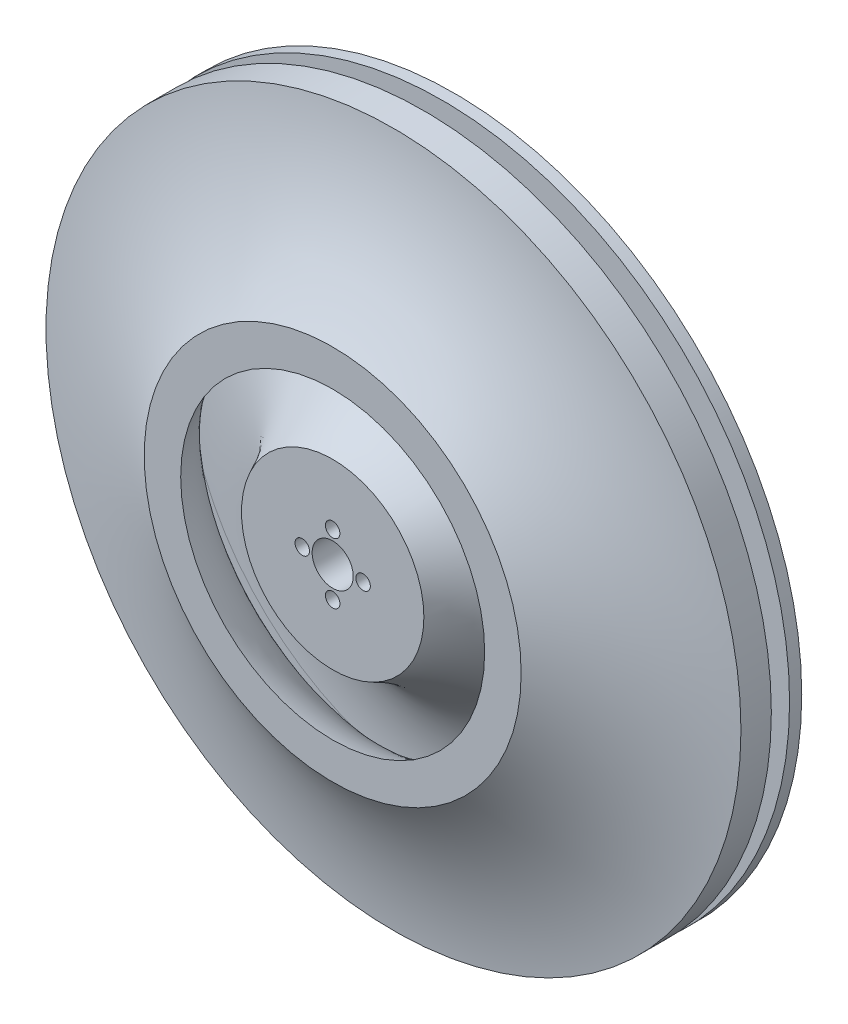
ISO-10303-21;
HEADER;
FILE_DESCRIPTION(('STEP AP214'),'2;1');
FILE_NAME('part.step','',(''),(''),'','','');
FILE_SCHEMA(('AUTOMOTIVE_DESIGN { 1 0 10303 214 1 1 1 1 }'));
ENDSEC;
DATA;
#1=APPLICATION_CONTEXT('core data for automotive mechanical design processes');
#2=APPLICATION_PROTOCOL_DEFINITION('international standard','automotive_design',2000,#1);
#3=PRODUCT_CONTEXT('',#1,'mechanical');
#4=PRODUCT('Part','Part','',(#3));
#5=PRODUCT_RELATED_PRODUCT_CATEGORY('part','',(#4));
#6=PRODUCT_DEFINITION_FORMATION('','',#4);
#7=PRODUCT_DEFINITION_CONTEXT('part definition',#1,'design');
#8=PRODUCT_DEFINITION('design','',#6,#7);
#9=PRODUCT_DEFINITION_SHAPE('','',#8);
#10=(LENGTH_UNIT() NAMED_UNIT(*) SI_UNIT(.MILLI.,.METRE.));
#11=(NAMED_UNIT(*) PLANE_ANGLE_UNIT() SI_UNIT($,.RADIAN.));
#12=(NAMED_UNIT(*) SI_UNIT($,.STERADIAN.) SOLID_ANGLE_UNIT());
#13=UNCERTAINTY_MEASURE_WITH_UNIT(LENGTH_MEASURE(1.E-05),#10,'distance_accuracy_value','');
#14=(GEOMETRIC_REPRESENTATION_CONTEXT(3) GLOBAL_UNCERTAINTY_ASSIGNED_CONTEXT((#13)) GLOBAL_UNIT_ASSIGNED_CONTEXT((#10,
#11,#12)) REPRESENTATION_CONTEXT('',''));
#15=CARTESIAN_POINT('',(0.,0.,0.));
#16=DIRECTION('',(0.,0.,1.));
#17=DIRECTION('',(1.,0.,0.));
#18=AXIS2_PLACEMENT_3D('',#15,#16,#17);
#19=CARTESIAN_POINT('',(0.,-57.15,2.));
#20=DIRECTION('',(0.,0.,-1.));
#21=DIRECTION('',(-1.,0.,0.));
#22=AXIS2_PLACEMENT_3D('',#19,#20,#21);
#23=PLANE('',#22);
#24=CARTESIAN_POINT('',(0.,0.,1.99999999999999));
#25=DIRECTION('',(0.,0.,1.));
#26=DIRECTION('',(1.,0.,0.));
#27=AXIS2_PLACEMENT_3D('',#24,#25,#26);
#28=CIRCLE('',#27,42.15);
#29=CARTESIAN_POINT('',(42.15,0.,1.99999999999999));
#30=VERTEX_POINT('',#29);
#31=EDGE_CURVE('E11',#30,#30,#28,.T.);
#32=ORIENTED_EDGE('',*,*,#31,.F.);
#33=EDGE_LOOP('',(#32));
#34=FACE_BOUND('',#33,.T.);
#35=CARTESIAN_POINT('',(0.,0.,1.99999999999999));
#36=DIRECTION('',(0.,0.,1.));
#37=DIRECTION('',(1.,0.,0.));
#38=AXIS2_PLACEMENT_3D('',#35,#36,#37);
#39=CIRCLE('',#38,57.15);
#40=CARTESIAN_POINT('',(57.15,0.,1.99999999999999));
#41=VERTEX_POINT('',#40);
#42=EDGE_CURVE('E122',#41,#41,#39,.T.);
#43=ORIENTED_EDGE('',*,*,#42,.T.);
#44=EDGE_LOOP('',(#43));
#45=FACE_BOUND('',#44,.T.);
#46=ADVANCED_FACE('F52',(#34,#45),#23,.F.);
#47=CARTESIAN_POINT('',(0.,0.,21.));
#48=DIRECTION('',(0.,0.,1.));
#49=DIRECTION('',(1.,0.,0.));
#50=AXIS2_PLACEMENT_3D('',#47,#48,#49);
#51=CYLINDRICAL_SURFACE('',#50,57.15);
#52=ORIENTED_EDGE('',*,*,#42,.F.);
#53=EDGE_LOOP('',(#52));
#54=FACE_BOUND('',#53,.T.);
#55=CARTESIAN_POINT('',(0.,0.,0.));
#56=DIRECTION('',(0.,0.,1.));
#57=DIRECTION('',(1.,0.,0.));
#58=AXIS2_PLACEMENT_3D('',#55,#56,#57);
#59=CIRCLE('',#58,57.15);
#60=CARTESIAN_POINT('',(57.15,0.,0.));
#61=VERTEX_POINT('',#60);
#62=EDGE_CURVE('E121',#61,#61,#59,.T.);
#63=ORIENTED_EDGE('',*,*,#62,.T.);
#64=EDGE_LOOP('',(#63));
#65=FACE_BOUND('',#64,.T.);
#66=ADVANCED_FACE('F174',(#54,#65),#51,.T.);
#67=CARTESIAN_POINT('',(0.,-37.025,0.));
#68=DIRECTION('',(0.,0.,1.));
#69=DIRECTION('',(1.,0.,0.));
#70=AXIS2_PLACEMENT_3D('',#67,#68,#69);
#71=PLANE('',#70);
#72=ORIENTED_EDGE('',*,*,#62,.F.);
#73=EDGE_LOOP('',(#72));
#74=FACE_BOUND('',#73,.T.);
#75=CARTESIAN_POINT('',(0.,0.,0.));
#76=DIRECTION('',(0.,0.,1.));
#77=DIRECTION('',(1.,0.,0.));
#78=AXIS2_PLACEMENT_3D('',#75,#76,#77);
#79=CIRCLE('',#78,37.025);
#80=CARTESIAN_POINT('',(37.025,0.,0.));
#81=VERTEX_POINT('',#80);
#82=EDGE_CURVE('E116',#81,#81,#79,.T.);
#83=ORIENTED_EDGE('',*,*,#82,.T.);
#84=EDGE_LOOP('',(#83));
#85=FACE_BOUND('',#84,.T.);
#86=ADVANCED_FACE('F179',(#74,#85),#71,.F.);
#87=CARTESIAN_POINT('',(0.,0.,21.));
#88=DIRECTION('',(0.,0.,1.));
#89=DIRECTION('',(1.,0.,0.));
#90=AXIS2_PLACEMENT_3D('',#87,#88,#89);
#91=CYLINDRICAL_SURFACE('',#90,37.025);
#92=ORIENTED_EDGE('',*,*,#82,.F.);
#93=EDGE_LOOP('',(#92));
#94=FACE_BOUND('',#93,.T.);
#95=CARTESIAN_POINT('',(0.,0.,1.));
#96=DIRECTION('',(0.,0.,1.));
#97=DIRECTION('',(1.,0.,0.));
#98=AXIS2_PLACEMENT_3D('',#95,#96,#97);
#99=CIRCLE('',#98,37.025);
#100=CARTESIAN_POINT('',(37.025,0.,1.));
#101=VERTEX_POINT('',#100);
#102=EDGE_CURVE('E113',#101,#101,#99,.T.);
#103=ORIENTED_EDGE('',*,*,#102,.T.);
#104=EDGE_LOOP('',(#103));
#105=FACE_BOUND('',#104,.T.);
#106=ADVANCED_FACE('F187',(#94,#105),#91,.F.);
#107=CARTESIAN_POINT('',(0.,-34.775,1.));
#108=DIRECTION('',(0.,0.,1.));
#109=DIRECTION('',(1.,0.,0.));
#110=AXIS2_PLACEMENT_3D('',#107,#108,#109);
#111=PLANE('',#110);
#112=ORIENTED_EDGE('',*,*,#102,.F.);
#113=EDGE_LOOP('',(#112));
#114=FACE_BOUND('',#113,.T.);
#115=CARTESIAN_POINT('',(0.,0.,1.));
#116=DIRECTION('',(0.,0.,1.));
#117=DIRECTION('',(1.,0.,0.));
#118=AXIS2_PLACEMENT_3D('',#115,#116,#117);
#119=CIRCLE('',#118,34.775);
#120=CARTESIAN_POINT('',(34.775,0.,1.));
#121=VERTEX_POINT('',#120);
#122=EDGE_CURVE('E115',#121,#121,#119,.T.);
#123=ORIENTED_EDGE('',*,*,#122,.T.);
#124=EDGE_LOOP('',(#123));
#125=FACE_BOUND('',#124,.T.);
#126=ADVANCED_FACE('F192',(#114,#125),#111,.F.);
#127=CARTESIAN_POINT('',(0.,0.,21.));
#128=DIRECTION('',(0.,0.,1.));
#129=DIRECTION('',(1.,0.,0.));
#130=AXIS2_PLACEMENT_3D('',#127,#128,#129);
#131=CYLINDRICAL_SURFACE('',#130,34.775);
#132=ORIENTED_EDGE('',*,*,#122,.F.);
#133=EDGE_LOOP('',(#132));
#134=FACE_BOUND('',#133,.T.);
#135=CARTESIAN_POINT('',(0.,0.,0.));
#136=DIRECTION('',(0.,0.,1.));
#137=DIRECTION('',(1.,0.,0.));
#138=AXIS2_PLACEMENT_3D('',#135,#136,#137);
#139=CIRCLE('',#138,34.775);
#140=CARTESIAN_POINT('',(34.775,0.,0.));
#141=VERTEX_POINT('',#140);
#142=EDGE_CURVE('E108',#141,#141,#139,.T.);
#143=ORIENTED_EDGE('',*,*,#142,.T.);
#144=EDGE_LOOP('',(#143));
#145=FACE_BOUND('',#144,.T.);
#146=ADVANCED_FACE('F196',(#134,#145),#131,.T.);
#147=CARTESIAN_POINT('',(0.,-33.025,0.));
#148=DIRECTION('',(0.,0.,1.));
#149=DIRECTION('',(1.,0.,0.));
#150=AXIS2_PLACEMENT_3D('',#147,#148,#149);
#151=PLANE('',#150);
#152=ORIENTED_EDGE('',*,*,#142,.F.);
#153=EDGE_LOOP('',(#152));
#154=FACE_BOUND('',#153,.T.);
#155=CARTESIAN_POINT('',(0.,0.,0.));
#156=DIRECTION('',(0.,0.,1.));
#157=DIRECTION('',(1.,0.,0.));
#158=AXIS2_PLACEMENT_3D('',#155,#156,#157);
#159=CIRCLE('',#158,33.025);
#160=CARTESIAN_POINT('',(33.025,0.,0.));
#161=VERTEX_POINT('',#160);
#162=EDGE_CURVE('E106',#161,#161,#159,.T.);
#163=ORIENTED_EDGE('',*,*,#162,.T.);
#164=EDGE_LOOP('',(#163));
#165=FACE_BOUND('',#164,.T.);
#166=ADVANCED_FACE('F205',(#154,#165),#151,.F.);
#167=CARTESIAN_POINT('',(0.,0.,21.));
#168=DIRECTION('',(0.,0.,1.));
#169=DIRECTION('',(1.,0.,0.));
#170=AXIS2_PLACEMENT_3D('',#167,#168,#169);
#171=CYLINDRICAL_SURFACE('',#170,33.025);
#172=ORIENTED_EDGE('',*,*,#162,.F.);
#173=EDGE_LOOP('',(#172));
#174=FACE_BOUND('',#173,.T.);
#175=CARTESIAN_POINT('',(0.,0.,1.));
#176=DIRECTION('',(0.,0.,1.));
#177=DIRECTION('',(1.,0.,0.));
#178=AXIS2_PLACEMENT_3D('',#175,#176,#177);
#179=CIRCLE('',#178,33.025);
#180=CARTESIAN_POINT('',(33.025,0.,1.));
#181=VERTEX_POINT('',#180);
#182=EDGE_CURVE('E103',#181,#181,#179,.T.);
#183=ORIENTED_EDGE('',*,*,#182,.T.);
#184=EDGE_LOOP('',(#183));
#185=FACE_BOUND('',#184,.T.);
#186=ADVANCED_FACE('F206',(#174,#185),#171,.F.);
#187=CARTESIAN_POINT('',(0.,-30.775,1.));
#188=DIRECTION('',(0.,0.,1.));
#189=DIRECTION('',(1.,0.,0.));
#190=AXIS2_PLACEMENT_3D('',#187,#188,#189);
#191=PLANE('',#190);
#192=ORIENTED_EDGE('',*,*,#182,.F.);
#193=EDGE_LOOP('',(#192));
#194=FACE_BOUND('',#193,.T.);
#195=CARTESIAN_POINT('',(0.,0.,1.));
#196=DIRECTION('',(0.,0.,1.));
#197=DIRECTION('',(1.,0.,0.));
#198=AXIS2_PLACEMENT_3D('',#195,#196,#197);
#199=CIRCLE('',#198,30.775);
#200=CARTESIAN_POINT('',(30.775,0.,1.));
#201=VERTEX_POINT('',#200);
#202=EDGE_CURVE('E99',#201,#201,#199,.T.);
#203=ORIENTED_EDGE('',*,*,#202,.T.);
#204=EDGE_LOOP('',(#203));
#205=FACE_BOUND('',#204,.T.);
#206=ADVANCED_FACE('F209',(#194,#205),#191,.F.);
#207=CARTESIAN_POINT('',(0.,0.,21.));
#208=DIRECTION('',(0.,0.,1.));
#209=DIRECTION('',(1.,0.,0.));
#210=AXIS2_PLACEMENT_3D('',#207,#208,#209);
#211=CYLINDRICAL_SURFACE('',#210,30.775);
#212=ORIENTED_EDGE('',*,*,#202,.F.);
#213=EDGE_LOOP('',(#212));
#214=FACE_BOUND('',#213,.T.);
#215=CARTESIAN_POINT('',(0.,0.,0.));
#216=DIRECTION('',(0.,0.,1.));
#217=DIRECTION('',(1.,0.,0.));
#218=AXIS2_PLACEMENT_3D('',#215,#216,#217);
#219=CIRCLE('',#218,30.775);
#220=CARTESIAN_POINT('',(30.775,0.,0.));
#221=VERTEX_POINT('',#220);
#222=EDGE_CURVE('E100',#221,#221,#219,.T.);
#223=ORIENTED_EDGE('',*,*,#222,.T.);
#224=EDGE_LOOP('',(#223));
#225=FACE_BOUND('',#224,.T.);
#226=ADVANCED_FACE('F212',(#214,#225),#211,.T.);
#227=CARTESIAN_POINT('',(0.,-29.025,0.));
#228=DIRECTION('',(0.,0.,1.));
#229=DIRECTION('',(1.,0.,0.));
#230=AXIS2_PLACEMENT_3D('',#227,#228,#229);
#231=PLANE('',#230);
#232=ORIENTED_EDGE('',*,*,#222,.F.);
#233=EDGE_LOOP('',(#232));
#234=FACE_BOUND('',#233,.T.);
#235=CARTESIAN_POINT('',(0.,0.,0.));
#236=DIRECTION('',(0.,0.,1.));
#237=DIRECTION('',(1.,0.,0.));
#238=AXIS2_PLACEMENT_3D('',#235,#236,#237);
#239=CIRCLE('',#238,29.025);
#240=CARTESIAN_POINT('',(29.025,0.,0.));
#241=VERTEX_POINT('',#240);
#242=EDGE_CURVE('E94',#241,#241,#239,.T.);
#243=ORIENTED_EDGE('',*,*,#242,.T.);
#244=EDGE_LOOP('',(#243));
#245=FACE_BOUND('',#244,.T.);
#246=ADVANCED_FACE('F217',(#234,#245),#231,.F.);
#247=CARTESIAN_POINT('',(0.,0.,21.));
#248=DIRECTION('',(0.,0.,1.));
#249=DIRECTION('',(1.,0.,0.));
#250=AXIS2_PLACEMENT_3D('',#247,#248,#249);
#251=CYLINDRICAL_SURFACE('',#250,29.025);
#252=ORIENTED_EDGE('',*,*,#242,.F.);
#253=EDGE_LOOP('',(#252));
#254=FACE_BOUND('',#253,.T.);
#255=CARTESIAN_POINT('',(0.,0.,1.));
#256=DIRECTION('',(0.,0.,1.));
#257=DIRECTION('',(1.,0.,0.));
#258=AXIS2_PLACEMENT_3D('',#255,#256,#257);
#259=CIRCLE('',#258,29.025);
#260=CARTESIAN_POINT('',(29.025,0.,1.));
#261=VERTEX_POINT('',#260);
#262=EDGE_CURVE('E93',#261,#261,#259,.T.);
#263=ORIENTED_EDGE('',*,*,#262,.T.);
#264=EDGE_LOOP('',(#263));
#265=FACE_BOUND('',#264,.T.);
#266=ADVANCED_FACE('F225',(#254,#265),#251,.F.);
#267=CARTESIAN_POINT('',(0.,-26.775,1.));
#268=DIRECTION('',(0.,0.,1.));
#269=DIRECTION('',(1.,0.,0.));
#270=AXIS2_PLACEMENT_3D('',#267,#268,#269);
#271=PLANE('',#270);
#272=ORIENTED_EDGE('',*,*,#262,.F.);
#273=EDGE_LOOP('',(#272));
#274=FACE_BOUND('',#273,.T.);
#275=CARTESIAN_POINT('',(0.,0.,1.));
#276=DIRECTION('',(0.,0.,1.));
#277=DIRECTION('',(1.,0.,0.));
#278=AXIS2_PLACEMENT_3D('',#275,#276,#277);
#279=CIRCLE('',#278,26.775);
#280=CARTESIAN_POINT('',(26.775,0.,1.));
#281=VERTEX_POINT('',#280);
#282=EDGE_CURVE('E86',#281,#281,#279,.T.);
#283=ORIENTED_EDGE('',*,*,#282,.T.);
#284=EDGE_LOOP('',(#283));
#285=FACE_BOUND('',#284,.T.);
#286=ADVANCED_FACE('F228',(#274,#285),#271,.F.);
#287=CARTESIAN_POINT('',(0.,0.,21.));
#288=DIRECTION('',(0.,0.,1.));
#289=DIRECTION('',(1.,0.,0.));
#290=AXIS2_PLACEMENT_3D('',#287,#288,#289);
#291=CYLINDRICAL_SURFACE('',#290,26.775);
#292=ORIENTED_EDGE('',*,*,#282,.F.);
#293=EDGE_LOOP('',(#292));
#294=FACE_BOUND('',#293,.T.);
#295=CARTESIAN_POINT('',(0.,0.,0.));
#296=DIRECTION('',(0.,0.,1.));
#297=DIRECTION('',(1.,0.,0.));
#298=AXIS2_PLACEMENT_3D('',#295,#296,#297);
#299=CIRCLE('',#298,26.775);
#300=CARTESIAN_POINT('',(26.775,0.,0.));
#301=VERTEX_POINT('',#300);
#302=EDGE_CURVE('E84',#301,#301,#299,.T.);
#303=ORIENTED_EDGE('',*,*,#302,.T.);
#304=EDGE_LOOP('',(#303));
#305=FACE_BOUND('',#304,.T.);
#306=ADVANCED_FACE('F227',(#294,#305),#291,.T.);
#307=CARTESIAN_POINT('',(0.,-25.025,0.));
#308=DIRECTION('',(0.,0.,1.));
#309=DIRECTION('',(1.,0.,0.));
#310=AXIS2_PLACEMENT_3D('',#307,#308,#309);
#311=PLANE('',#310);
#312=ORIENTED_EDGE('',*,*,#302,.F.);
#313=EDGE_LOOP('',(#312));
#314=FACE_BOUND('',#313,.T.);
#315=CARTESIAN_POINT('',(0.,0.,0.));
#316=DIRECTION('',(0.,0.,1.));
#317=DIRECTION('',(1.,0.,0.));
#318=AXIS2_PLACEMENT_3D('',#315,#316,#317);
#319=CIRCLE('',#318,25.025);
#320=CARTESIAN_POINT('',(25.025,0.,0.));
#321=VERTEX_POINT('',#320);
#322=EDGE_CURVE('E85',#321,#321,#319,.T.);
#323=ORIENTED_EDGE('',*,*,#322,.T.);
#324=EDGE_LOOP('',(#323));
#325=FACE_BOUND('',#324,.T.);
#326=ADVANCED_FACE('F232',(#314,#325),#311,.F.);
#327=CARTESIAN_POINT('',(0.,0.,21.));
#328=DIRECTION('',(0.,0.,1.));
#329=DIRECTION('',(1.,0.,0.));
#330=AXIS2_PLACEMENT_3D('',#327,#328,#329);
#331=CYLINDRICAL_SURFACE('',#330,25.025);
#332=ORIENTED_EDGE('',*,*,#322,.F.);
#333=EDGE_LOOP('',(#332));
#334=FACE_BOUND('',#333,.T.);
#335=CARTESIAN_POINT('',(0.,0.,1.));
#336=DIRECTION('',(0.,0.,1.));
#337=DIRECTION('',(1.,0.,0.));
#338=AXIS2_PLACEMENT_3D('',#335,#336,#337);
#339=CIRCLE('',#338,25.025);
#340=CARTESIAN_POINT('',(25.025,0.,1.));
#341=VERTEX_POINT('',#340);
#342=EDGE_CURVE('E79',#341,#341,#339,.T.);
#343=ORIENTED_EDGE('',*,*,#342,.T.);
#344=EDGE_LOOP('',(#343));
#345=FACE_BOUND('',#344,.T.);
#346=ADVANCED_FACE('F236',(#334,#345),#331,.F.);
#347=CARTESIAN_POINT('',(0.,-22.775,1.));
#348=DIRECTION('',(0.,0.,1.));
#349=DIRECTION('',(1.,0.,0.));
#350=AXIS2_PLACEMENT_3D('',#347,#348,#349);
#351=PLANE('',#350);
#352=ORIENTED_EDGE('',*,*,#342,.F.);
#353=EDGE_LOOP('',(#352));
#354=FACE_BOUND('',#353,.T.);
#355=CARTESIAN_POINT('',(0.,0.,1.));
#356=DIRECTION('',(0.,0.,1.));
#357=DIRECTION('',(1.,0.,0.));
#358=AXIS2_PLACEMENT_3D('',#355,#356,#357);
#359=CIRCLE('',#358,22.775);
#360=CARTESIAN_POINT('',(22.775,0.,1.));
#361=VERTEX_POINT('',#360);
#362=EDGE_CURVE('E78',#361,#361,#359,.T.);
#363=ORIENTED_EDGE('',*,*,#362,.T.);
#364=EDGE_LOOP('',(#363));
#365=FACE_BOUND('',#364,.T.);
#366=ADVANCED_FACE('F245',(#354,#365),#351,.F.);
#367=CARTESIAN_POINT('',(0.,0.,21.));
#368=DIRECTION('',(0.,0.,1.));
#369=DIRECTION('',(1.,0.,0.));
#370=AXIS2_PLACEMENT_3D('',#367,#368,#369);
#371=CYLINDRICAL_SURFACE('',#370,22.775);
#372=ORIENTED_EDGE('',*,*,#362,.F.);
#373=EDGE_LOOP('',(#372));
#374=FACE_BOUND('',#373,.T.);
#375=CARTESIAN_POINT('',(0.,0.,0.));
#376=DIRECTION('',(0.,0.,1.));
#377=DIRECTION('',(1.,0.,0.));
#378=AXIS2_PLACEMENT_3D('',#375,#376,#377);
#379=CIRCLE('',#378,22.775);
#380=CARTESIAN_POINT('',(22.775,0.,0.));
#381=VERTEX_POINT('',#380);
#382=EDGE_CURVE('E71',#381,#381,#379,.T.);
#383=ORIENTED_EDGE('',*,*,#382,.T.);
#384=EDGE_LOOP('',(#383));
#385=FACE_BOUND('',#384,.T.);
#386=ADVANCED_FACE('F246',(#374,#385),#371,.T.);
#387=CARTESIAN_POINT('',(0.,-22.775,0.));
#388=DIRECTION('',(0.,0.,-1.));
#389=DIRECTION('',(-1.,0.,0.));
#390=AXIS2_PLACEMENT_3D('',#387,#388,#389);
#391=PLANE('',#390);
#392=CARTESIAN_POINT('',(0.,0.,0.));
#393=DIRECTION('',(0.,0.,1.));
#394=DIRECTION('',(1.,0.,0.));
#395=AXIS2_PLACEMENT_3D('',#392,#393,#394);
#396=CIRCLE('',#395,12.5);
#397=CARTESIAN_POINT('',(12.5,0.,0.));
#398=VERTEX_POINT('',#397);
#399=EDGE_CURVE('E68',#398,#398,#396,.T.);
#400=ORIENTED_EDGE('',*,*,#399,.T.);
#401=EDGE_LOOP('',(#400));
#402=FACE_BOUND('',#401,.T.);
#403=ORIENTED_EDGE('',*,*,#382,.F.);
#404=EDGE_LOOP('',(#403));
#405=FACE_BOUND('',#404,.T.);
#406=ADVANCED_FACE('F249',(#402,#405),#391,.T.);
#407=CARTESIAN_POINT('',(0.,0.,21.));
#408=DIRECTION('',(0.,0.,1.));
#409=DIRECTION('',(1.,0.,0.));
#410=AXIS2_PLACEMENT_3D('',#407,#408,#409);
#411=CYLINDRICAL_SURFACE('',#410,12.5);
#412=ORIENTED_EDGE('',*,*,#399,.F.);
#413=EDGE_LOOP('',(#412));
#414=FACE_BOUND('',#413,.T.);
#415=CARTESIAN_POINT('',(0.,0.,-15.));
#416=DIRECTION('',(0.,0.,1.));
#417=DIRECTION('',(1.,0.,0.));
#418=AXIS2_PLACEMENT_3D('',#415,#416,#417);
#419=CIRCLE('',#418,12.5);
#420=CARTESIAN_POINT('',(12.5,0.,-15.));
#421=VERTEX_POINT('',#420);
#422=EDGE_CURVE('E64',#421,#421,#419,.T.);
#423=ORIENTED_EDGE('',*,*,#422,.T.);
#424=EDGE_LOOP('',(#423));
#425=FACE_BOUND('',#424,.T.);
#426=ADVANCED_FACE('F255',(#414,#425),#411,.T.);
#427=CARTESIAN_POINT('',(0.,0.,-15.));
#428=DIRECTION('',(0.,0.,1.));
#429=DIRECTION('',(1.,0.,0.));
#430=AXIS2_PLACEMENT_3D('',#427,#428,#429);
#431=PLANE('',#430);
#432=CARTESIAN_POINT('',(0.,-5.,-15.));
#433=DIRECTION('',(0.,0.,1.));
#434=DIRECTION('',(1.,0.,0.));
#435=AXIS2_PLACEMENT_3D('',#432,#433,#434);
#436=CIRCLE('',#435,1.190625);
#437=CARTESIAN_POINT('',(1.190625,-5.,-15.));
#438=VERTEX_POINT('',#437);
#439=EDGE_CURVE('E137',#438,#438,#436,.T.);
#440=ORIENTED_EDGE('',*,*,#439,.T.);
#441=EDGE_LOOP('',(#440));
#442=FACE_BOUND('',#441,.T.);
#443=CARTESIAN_POINT('',(0.,0.,-15.));
#444=DIRECTION('',(0.,0.,1.));
#445=DIRECTION('',(1.,0.,0.));
#446=AXIS2_PLACEMENT_3D('',#443,#444,#445);
#447=CIRCLE('',#446,3.3782);
#448=CARTESIAN_POINT('',(3.3782,0.,-15.));
#449=VERTEX_POINT('',#448);
#450=EDGE_CURVE('E148',#449,#449,#447,.T.);
#451=ORIENTED_EDGE('',*,*,#450,.T.);
#452=EDGE_LOOP('',(#451));
#453=FACE_BOUND('',#452,.T.);
#454=CARTESIAN_POINT('',(5.,0.,-15.));
#455=DIRECTION('',(0.,0.,1.));
#456=DIRECTION('',(1.,0.,0.));
#457=AXIS2_PLACEMENT_3D('',#454,#455,#456);
#458=CIRCLE('',#457,1.190625);
#459=CARTESIAN_POINT('',(6.190625,0.,-15.));
#460=VERTEX_POINT('',#459);
#461=EDGE_CURVE('E144',#460,#460,#458,.T.);
#462=ORIENTED_EDGE('',*,*,#461,.T.);
#463=EDGE_LOOP('',(#462));
#464=FACE_BOUND('',#463,.T.);
#465=CARTESIAN_POINT('',(0.,5.,-15.));
#466=DIRECTION('',(0.,0.,1.));
#467=DIRECTION('',(1.,0.,0.));
#468=AXIS2_PLACEMENT_3D('',#465,#466,#467);
#469=CIRCLE('',#468,1.190625);
#470=CARTESIAN_POINT('',(1.190625,5.,-15.));
#471=VERTEX_POINT('',#470);
#472=EDGE_CURVE('E135',#471,#471,#469,.T.);
#473=ORIENTED_EDGE('',*,*,#472,.T.);
#474=EDGE_LOOP('',(#473));
#475=FACE_BOUND('',#474,.T.);
#476=CARTESIAN_POINT('',(-5.,0.,-15.));
#477=DIRECTION('',(0.,0.,1.));
#478=DIRECTION('',(1.,0.,0.));
#479=AXIS2_PLACEMENT_3D('',#476,#477,#478);
#480=CIRCLE('',#479,1.190625);
#481=CARTESIAN_POINT('',(-3.809375,0.,-15.));
#482=VERTEX_POINT('',#481);
#483=EDGE_CURVE('E133',#482,#482,#480,.T.);
#484=ORIENTED_EDGE('',*,*,#483,.T.);
#485=EDGE_LOOP('',(#484));
#486=FACE_BOUND('',#485,.T.);
#487=ORIENTED_EDGE('',*,*,#422,.F.);
#488=EDGE_LOOP('',(#487));
#489=FACE_BOUND('',#488,.T.);
#490=ADVANCED_FACE('F158',(#442,#453,#464,#475,#486,#489),#431,.F.);
#491=CARTESIAN_POINT('',(0.,-15.,20.));
#492=DIRECTION('',(0.,0.,-1.));
#493=DIRECTION('',(-1.,0.,0.));
#494=AXIS2_PLACEMENT_3D('',#491,#492,#493);
#495=PLANE('',#494);
#496=CARTESIAN_POINT('',(0.,-5.,20.));
#497=DIRECTION('',(0.,0.,1.));
#498=DIRECTION('',(1.,0.,0.));
#499=AXIS2_PLACEMENT_3D('',#496,#497,#498);
#500=CIRCLE('',#499,1.190625);
#501=CARTESIAN_POINT('',(1.190625,-5.,20.));
#502=VERTEX_POINT('',#501);
#503=EDGE_CURVE('E130',#502,#502,#500,.T.);
#504=ORIENTED_EDGE('',*,*,#503,.F.);
#505=EDGE_LOOP('',(#504));
#506=FACE_BOUND('',#505,.T.);
#507=CARTESIAN_POINT('',(0.,0.,20.));
#508=DIRECTION('',(0.,0.,1.));
#509=DIRECTION('',(1.,0.,0.));
#510=AXIS2_PLACEMENT_3D('',#507,#508,#509);
#511=CIRCLE('',#510,3.3782);
#512=CARTESIAN_POINT('',(3.3782,0.,20.));
#513=VERTEX_POINT('',#512);
#514=EDGE_CURVE('E142',#513,#513,#511,.T.);
#515=ORIENTED_EDGE('',*,*,#514,.F.);
#516=EDGE_LOOP('',(#515));
#517=FACE_BOUND('',#516,.T.);
#518=CARTESIAN_POINT('',(5.,0.,20.));
#519=DIRECTION('',(0.,0.,1.));
#520=DIRECTION('',(1.,0.,0.));
#521=AXIS2_PLACEMENT_3D('',#518,#519,#520);
#522=CIRCLE('',#521,1.190625);
#523=CARTESIAN_POINT('',(6.190625,0.,20.));
#524=VERTEX_POINT('',#523);
#525=EDGE_CURVE('E132',#524,#524,#522,.T.);
#526=ORIENTED_EDGE('',*,*,#525,.F.);
#527=EDGE_LOOP('',(#526));
#528=FACE_BOUND('',#527,.T.);
#529=CARTESIAN_POINT('',(0.,5.,20.));
#530=DIRECTION('',(0.,0.,1.));
#531=DIRECTION('',(1.,0.,0.));
#532=AXIS2_PLACEMENT_3D('',#529,#530,#531);
#533=CIRCLE('',#532,1.190625);
#534=CARTESIAN_POINT('',(1.190625,5.,20.));
#535=VERTEX_POINT('',#534);
#536=EDGE_CURVE('E126',#535,#535,#533,.T.);
#537=ORIENTED_EDGE('',*,*,#536,.F.);
#538=EDGE_LOOP('',(#537));
#539=FACE_BOUND('',#538,.T.);
#540=CARTESIAN_POINT('',(-5.,0.,20.));
#541=DIRECTION('',(0.,0.,1.));
#542=DIRECTION('',(1.,0.,0.));
#543=AXIS2_PLACEMENT_3D('',#540,#541,#542);
#544=CIRCLE('',#543,1.190625);
#545=CARTESIAN_POINT('',(-3.809375,0.,20.));
#546=VERTEX_POINT('',#545);
#547=EDGE_CURVE('E136',#546,#546,#544,.T.);
#548=ORIENTED_EDGE('',*,*,#547,.F.);
#549=EDGE_LOOP('',(#548));
#550=FACE_BOUND('',#549,.T.);
#551=CARTESIAN_POINT('',(0.,0.,20.));
#552=DIRECTION('',(0.,0.,1.));
#553=DIRECTION('',(1.,0.,0.));
#554=AXIS2_PLACEMENT_3D('',#551,#552,#553);
#555=CIRCLE('',#554,15.);
#556=CARTESIAN_POINT('',(15.,0.,20.));
#557=VERTEX_POINT('',#556);
#558=EDGE_CURVE('E58',#557,#557,#555,.T.);
#559=ORIENTED_EDGE('',*,*,#558,.T.);
#560=EDGE_LOOP('',(#559));
#561=FACE_BOUND('',#560,.T.);
#562=ADVANCED_FACE('F257',(#506,#517,#528,#539,#550,#561),#495,.F.);
#563=CARTESIAN_POINT('',(0.,0.,31.475625));
#564=DIRECTION('',(0.,0.,1.));
#565=DIRECTION('',(1.,0.,0.));
#566=AXIS2_PLACEMENT_3D('',#563,#564,#565);
#567=TOROIDAL_SURFACE('',#566,42.15,29.475625);
#568=ORIENTED_EDGE('',*,*,#558,.F.);
#569=EDGE_LOOP('',(#568));
#570=FACE_BOUND('',#569,.T.);
#571=ORIENTED_EDGE('',*,*,#31,.T.);
#572=EDGE_LOOP('',(#571));
#573=FACE_BOUND('',#572,.T.);
#574=ADVANCED_FACE('F54',(#570,#573),#567,.F.);
#575=CARTESIAN_POINT('',(-5.,0.,20.));
#576=DIRECTION('',(0.,0.,-1.));
#577=DIRECTION('',(-1.,0.,0.));
#578=AXIS2_PLACEMENT_3D('',#575,#576,#577);
#579=CYLINDRICAL_SURFACE('',#578,1.190625);
#580=ORIENTED_EDGE('',*,*,#547,.T.);
#581=EDGE_LOOP('',(#580));
#582=FACE_BOUND('',#581,.T.);
#583=ORIENTED_EDGE('',*,*,#483,.F.);
#584=EDGE_LOOP('',(#583));
#585=FACE_BOUND('',#584,.T.);
#586=ADVANCED_FACE('F270',(#582,#585),#579,.F.);
#587=CARTESIAN_POINT('',(0.,5.,20.));
#588=DIRECTION('',(0.,0.,-1.));
#589=DIRECTION('',(-1.,0.,0.));
#590=AXIS2_PLACEMENT_3D('',#587,#588,#589);
#591=CYLINDRICAL_SURFACE('',#590,1.190625);
#592=ORIENTED_EDGE('',*,*,#536,.T.);
#593=EDGE_LOOP('',(#592));
#594=FACE_BOUND('',#593,.T.);
#595=ORIENTED_EDGE('',*,*,#472,.F.);
#596=EDGE_LOOP('',(#595));
#597=FACE_BOUND('',#596,.T.);
#598=ADVANCED_FACE('F183',(#594,#597),#591,.F.);
#599=CARTESIAN_POINT('',(5.,0.,20.));
#600=DIRECTION('',(0.,0.,-1.));
#601=DIRECTION('',(-1.,0.,0.));
#602=AXIS2_PLACEMENT_3D('',#599,#600,#601);
#603=CYLINDRICAL_SURFACE('',#602,1.190625);
#604=ORIENTED_EDGE('',*,*,#525,.T.);
#605=EDGE_LOOP('',(#604));
#606=FACE_BOUND('',#605,.T.);
#607=ORIENTED_EDGE('',*,*,#461,.F.);
#608=EDGE_LOOP('',(#607));
#609=FACE_BOUND('',#608,.T.);
#610=ADVANCED_FACE('F166',(#606,#609),#603,.F.);
#611=CARTESIAN_POINT('',(0.,0.,20.));
#612=DIRECTION('',(0.,0.,-1.));
#613=DIRECTION('',(-1.,0.,0.));
#614=AXIS2_PLACEMENT_3D('',#611,#612,#613);
#615=CYLINDRICAL_SURFACE('',#614,3.3782);
#616=ORIENTED_EDGE('',*,*,#514,.T.);
#617=EDGE_LOOP('',(#616));
#618=FACE_BOUND('',#617,.T.);
#619=ORIENTED_EDGE('',*,*,#450,.F.);
#620=EDGE_LOOP('',(#619));
#621=FACE_BOUND('',#620,.T.);
#622=ADVANCED_FACE('F162',(#618,#621),#615,.F.);
#623=CARTESIAN_POINT('',(0.,-5.,20.));
#624=DIRECTION('',(0.,0.,-1.));
#625=DIRECTION('',(-1.,0.,0.));
#626=AXIS2_PLACEMENT_3D('',#623,#624,#625);
#627=CYLINDRICAL_SURFACE('',#626,1.190625);
#628=ORIENTED_EDGE('',*,*,#503,.T.);
#629=EDGE_LOOP('',(#628));
#630=FACE_BOUND('',#629,.T.);
#631=ORIENTED_EDGE('',*,*,#439,.F.);
#632=EDGE_LOOP('',(#631));
#633=FACE_BOUND('',#632,.T.);
#634=ADVANCED_FACE('F161',(#630,#633),#627,.F.);
#635=CLOSED_SHELL('',(#46,#66,#86,#106,#126,#146,#166,#186,#206,#226,#246,#266,#286,#306,#326,
#346,#366,#386,#406,#426,#490,#562,#574,#586,#598,#610,#622,#634));
#636=MANIFOLD_SOLID_BREP('B2',#635);
#637=CARTESIAN_POINT('',(0.,0.,64.6801284490109));
#638=DIRECTION('',(0.,0.,1.));
#639=DIRECTION('',(1.,0.,0.));
#640=AXIS2_PLACEMENT_3D('',#637,#638,#639);
#641=TOROIDAL_SURFACE('',#640,63.0731370741916,55.);
#642=CARTESIAN_POINT('',(0.,0.,20.));
#643=DIRECTION('',(0.,0.,1.));
#644=DIRECTION('',(1.,0.,0.));
#645=AXIS2_PLACEMENT_3D('',#642,#643,#644);
#646=CIRCLE('',#645,31.);
#647=CARTESIAN_POINT('',(31.,0.,20.));
#648=VERTEX_POINT('',#647);
#649=EDGE_CURVE('E516',#648,#648,#646,.T.);
#650=ORIENTED_EDGE('',*,*,#649,.F.);
#651=EDGE_LOOP('',(#650));
#652=FACE_BOUND('',#651,.T.);
#653=CARTESIAN_POINT('',(0.,0.,10.));
#654=DIRECTION('',(0.,0.,1.));
#655=DIRECTION('',(1.,0.,0.));
#656=AXIS2_PLACEMENT_3D('',#653,#654,#655);
#657=CIRCLE('',#656,57.15);
#658=CARTESIAN_POINT('',(57.15,0.,10.));
#659=VERTEX_POINT('',#658);
#660=EDGE_CURVE('E55',#659,#659,#657,.T.);
#661=ORIENTED_EDGE('',*,*,#660,.T.);
#662=EDGE_LOOP('',(#661));
#663=FACE_BOUND('',#662,.T.);
#664=ADVANCED_FACE('F496',(#652,#663),#641,.F.);
#665=CARTESIAN_POINT('',(0.,0.,21.));
#666=DIRECTION('',(0.,0.,1.));
#667=DIRECTION('',(1.,0.,0.));
#668=AXIS2_PLACEMENT_3D('',#665,#666,#667);
#669=CYLINDRICAL_SURFACE('',#668,57.15);
#670=CARTESIAN_POINT('',(0.,0.,5.));
#671=DIRECTION('',(0.,0.,1.));
#672=DIRECTION('',(1.,0.,0.));
#673=AXIS2_PLACEMENT_3D('',#670,#671,#672);
#674=CIRCLE('',#673,57.15);
#675=CARTESIAN_POINT('',(57.15,0.,5.));
#676=VERTEX_POINT('',#675);
#677=EDGE_CURVE('E502',#676,#676,#674,.T.);
#678=ORIENTED_EDGE('',*,*,#677,.T.);
#679=EDGE_LOOP('',(#678));
#680=FACE_BOUND('',#679,.T.);
#681=ORIENTED_EDGE('',*,*,#660,.F.);
#682=EDGE_LOOP('',(#681));
#683=FACE_BOUND('',#682,.T.);
#684=ADVANCED_FACE('F524',(#680,#683),#669,.T.);
#685=CARTESIAN_POINT('',(0.,0.,5.));
#686=DIRECTION('',(0.,0.,-1.));
#687=DIRECTION('',(-1.,0.,0.));
#688=AXIS2_PLACEMENT_3D('',#685,#686,#687);
#689=CONICAL_SURFACE('',#688,57.15,1.48352986419518);
#690=CARTESIAN_POINT('',(0.,0.,6.31232995288886));
#691=DIRECTION('',(0.,0.,1.));
#692=DIRECTION('',(1.,0.,0.));
#693=AXIS2_PLACEMENT_3D('',#690,#691,#692);
#694=CIRCLE('',#693,42.15);
#695=CARTESIAN_POINT('',(42.15,0.,6.31232995288886));
#696=VERTEX_POINT('',#695);
#697=EDGE_CURVE('E507',#696,#696,#694,.T.);
#698=ORIENTED_EDGE('',*,*,#697,.T.);
#699=EDGE_LOOP('',(#698));
#700=FACE_BOUND('',#699,.T.);
#701=ORIENTED_EDGE('',*,*,#677,.F.);
#702=EDGE_LOOP('',(#701));
#703=FACE_BOUND('',#702,.T.);
#704=ADVANCED_FACE('F530',(#700,#703),#689,.F.);
#705=CARTESIAN_POINT('',(0.,0.,26.0655649901158));
#706=DIRECTION('',(0.,0.,1.));
#707=DIRECTION('',(1.,0.,0.));
#708=AXIS2_PLACEMENT_3D('',#705,#706,#707);
#709=TOROIDAL_SURFACE('',#708,43.8781841337204,19.8286891860247);
#710=CARTESIAN_POINT('',(0.,0.,20.));
#711=DIRECTION('',(0.,0.,1.));
#712=DIRECTION('',(1.,0.,0.));
#713=AXIS2_PLACEMENT_3D('',#710,#711,#712);
#714=CIRCLE('',#713,25.);
#715=CARTESIAN_POINT('',(25.,0.,20.));
#716=VERTEX_POINT('',#715);
#717=EDGE_CURVE('E511',#716,#716,#714,.T.);
#718=ORIENTED_EDGE('',*,*,#717,.T.);
#719=EDGE_LOOP('',(#718));
#720=FACE_BOUND('',#719,.T.);
#721=ORIENTED_EDGE('',*,*,#697,.F.);
#722=EDGE_LOOP('',(#721));
#723=FACE_BOUND('',#722,.T.);
#724=ADVANCED_FACE('F534',(#720,#723),#709,.T.);
#725=CARTESIAN_POINT('',(0.,0.,20.));
#726=DIRECTION('',(0.,0.,-1.));
#727=DIRECTION('',(-1.,0.,0.));
#728=AXIS2_PLACEMENT_3D('',#725,#726,#727);
#729=PLANE('',#728);
#730=ORIENTED_EDGE('',*,*,#717,.F.);
#731=EDGE_LOOP('',(#730));
#732=FACE_BOUND('',#731,.T.);
#733=ORIENTED_EDGE('',*,*,#649,.T.);
#734=EDGE_LOOP('',(#733));
#735=FACE_BOUND('',#734,.T.);
#736=ADVANCED_FACE('F525',(#732,#735),#729,.F.);
#737=CLOSED_SHELL('',(#664,#684,#704,#724,#736));
#738=MANIFOLD_SOLID_BREP('B6',#737);
#739=ADVANCED_BREP_SHAPE_REPRESENTATION('',(#18,#636,#738),#14);
#740=SHAPE_DEFINITION_REPRESENTATION(#9,#739);
ENDSEC;
END-ISO-10303-21;
